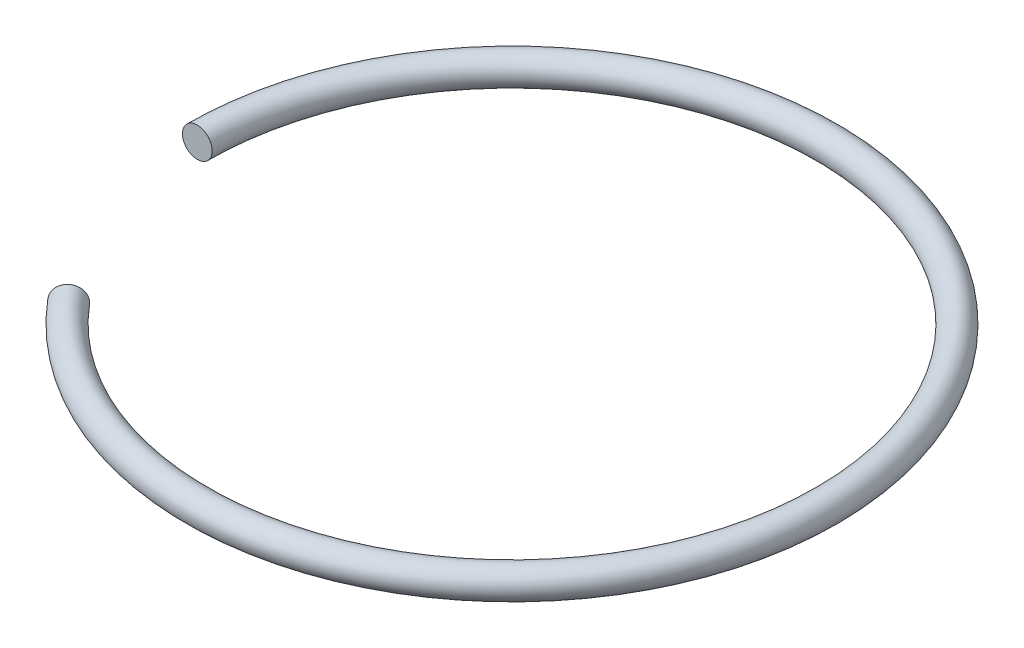
ISO-10303-21;
HEADER;
FILE_DESCRIPTION(('STEP AP214'),'2;1');
FILE_NAME('part.step','',(''),(''),'','','');
FILE_SCHEMA(('AUTOMOTIVE_DESIGN { 1 0 10303 214 1 1 1 1 }'));
ENDSEC;
DATA;
#1=APPLICATION_CONTEXT('core data for automotive mechanical design processes');
#2=APPLICATION_PROTOCOL_DEFINITION('international standard','automotive_design',2000,#1);
#3=PRODUCT_CONTEXT('',#1,'mechanical');
#4=PRODUCT('Part','Part','',(#3));
#5=PRODUCT_RELATED_PRODUCT_CATEGORY('part','',(#4));
#6=PRODUCT_DEFINITION_FORMATION('','',#4);
#7=PRODUCT_DEFINITION_CONTEXT('part definition',#1,'design');
#8=PRODUCT_DEFINITION('design','',#6,#7);
#9=PRODUCT_DEFINITION_SHAPE('','',#8);
#10=(LENGTH_UNIT() NAMED_UNIT(*) SI_UNIT(.MILLI.,.METRE.));
#11=(NAMED_UNIT(*) PLANE_ANGLE_UNIT() SI_UNIT($,.RADIAN.));
#12=(NAMED_UNIT(*) SI_UNIT($,.STERADIAN.) SOLID_ANGLE_UNIT());
#13=UNCERTAINTY_MEASURE_WITH_UNIT(LENGTH_MEASURE(1.E-05),#10,'distance_accuracy_value','');
#14=(GEOMETRIC_REPRESENTATION_CONTEXT(3) GLOBAL_UNCERTAINTY_ASSIGNED_CONTEXT((#13)) GLOBAL_UNIT_ASSIGNED_CONTEXT((#10,
#11,#12)) REPRESENTATION_CONTEXT('',''));
#15=CARTESIAN_POINT('',(0.,0.,0.));
#16=DIRECTION('',(0.,0.,1.));
#17=DIRECTION('',(1.,0.,0.));
#18=AXIS2_PLACEMENT_3D('',#15,#16,#17);
#19=CARTESIAN_POINT('',(0.,0.,0.));
#20=DIRECTION('',(0.64278760968653,0.,0.766044443118986));
#21=DIRECTION('',(0.766044443118986,0.,-0.64278760968653));
#22=AXIS2_PLACEMENT_3D('',#19,#20,#21);
#23=PLANE('',#22);
#24=CARTESIAN_POINT('',(-1.96034603216364,2.413,1.64492563256832));
#25=CARTESIAN_POINT('',(-1.96035292650767,2.42723035707391,1.64493141760985));
#26=CARTESIAN_POINT('',(-1.96221096147189,2.44154828029162,1.64649049406304));
#27=CARTESIAN_POINT('',(-1.9694495467463,2.46852713981076,1.65256438829705));
#28=CARTESIAN_POINT('',(-1.97483009705651,2.48118807611218,1.65707920607787));
#29=CARTESIAN_POINT('',(-1.98849913398992,2.5034838982527,1.66854888992724));
#30=CARTESIAN_POINT('',(-1.99678762061319,2.51311878409172,1.67550375599585));
#31=CARTESIAN_POINT('',(-2.01534020393233,2.52826068307499,1.69107122181633));
#32=CARTESIAN_POINT('',(-2.0256043006282,2.53376769621925,1.69968382156819));
#33=CARTESIAN_POINT('',(-2.04695031684461,2.54003686264336,1.71759525590249));
#34=CARTESIAN_POINT('',(-2.05803223636515,2.54079901592321,1.72689409048491));
#35=CARTESIAN_POINT('',(-2.0797647109435,2.53749255040931,1.74512980188817));
#36=CARTESIAN_POINT('',(-2.0904152660013,2.53342393161555,1.754066678709));
#37=CARTESIAN_POINT('',(-2.11008397027539,2.52091068190603,1.77057068121113));
#38=CARTESIAN_POINT('',(-2.11910211949168,2.51246605099026,1.77813780689242));
#39=CARTESIAN_POINT('',(-2.13449015744858,2.49216861413728,1.7910499038666));
#40=CARTESIAN_POINT('',(-2.14086004618918,2.48031580820007,1.79639487515947));
#41=CARTESIAN_POINT('',(-2.15023018552641,2.4544792051199,1.80425735562142));
#42=CARTESIAN_POINT('',(-2.15323043612304,2.44049540797694,1.80677486479049));
#43=CARTESIAN_POINT('',(-2.15474385138177,2.42191030553464,1.80804477097591));
#44=CARTESIAN_POINT('',(-2.15492348123786,2.41745945246293,1.80819549832191));
#45=CARTESIAN_POINT('',(-2.15491442637183,2.39876964292609,1.80818790038716));
#46=CARTESIAN_POINT('',(-2.15305639140762,2.38445171970838,1.80662882393397));
#47=CARTESIAN_POINT('',(-2.1458178061332,2.35747286018924,1.80055492969997));
#48=CARTESIAN_POINT('',(-2.14043725582299,2.34481192388782,1.79604011191914));
#49=CARTESIAN_POINT('',(-2.12676821888958,2.3225161017473,1.78457042806977));
#50=CARTESIAN_POINT('',(-2.11847973226631,2.31288121590828,1.77761556200116));
#51=CARTESIAN_POINT('',(-2.09992714894717,2.29773931692501,1.76204809618068));
#52=CARTESIAN_POINT('',(-2.0896630522513,2.29223230378075,1.75343549642882));
#53=CARTESIAN_POINT('',(-2.0683170360349,2.28596313735664,1.73552406209453));
#54=CARTESIAN_POINT('',(-2.05723511651435,2.28520098407679,1.7262252275121));
#55=CARTESIAN_POINT('',(-2.03550264193601,2.28850744959069,1.70798951610884));
#56=CARTESIAN_POINT('',(-2.0248520868782,2.29257606838445,1.69905263928801));
#57=CARTESIAN_POINT('',(-2.00518338260411,2.30508931809397,1.68254863678588));
#58=CARTESIAN_POINT('',(-1.99616523338782,2.31353394900974,1.67498151110459));
#59=CARTESIAN_POINT('',(-1.98077719543092,2.33383138586272,1.66206941413042));
#60=CARTESIAN_POINT('',(-1.97440730669032,2.34568419179993,1.65672444283754));
#61=CARTESIAN_POINT('',(-1.96503716735309,2.3715207948801,1.64886196237559));
#62=CARTESIAN_POINT('',(-1.96203691675647,2.38550459202306,1.64634445320652));
#63=CARTESIAN_POINT('',(-1.96052350149774,2.40408969446536,1.6450745470211));
#64=CARTESIAN_POINT('',(-1.96034387164164,2.40854054753707,1.6449238196751));
#65=CARTESIAN_POINT('',(-1.96034603216364,2.413,1.64492563256832));
#66=B_SPLINE_CURVE_WITH_KNOTS('',3,(#24,#25,#26,#27,#28,#29,#30,#31,#32,#33,#34,#35,#36,#37,#38,
#39,#40,#41,#42,#43,#44,#45,#46,#47,#48,#49,#50,#51,#52,#53,#54,#55,#56,#57,#58,#59,#60,#61,#62,
#63,#64,#65),.UNSPECIFIED.,.T.,.F.,(4,2,2,2,2,2,2,2,2,2,2,2,2,2,2,2,2,2,2,2,4),(0.,
0.0426429642402328,0.0852859284804661,0.127928892721775,0.170571856963084,0.213214821204393,
0.255857785445702,0.298500749687011,0.34114371392832,0.383786678169629,0.39714995998469,
0.439792924224922,0.482435888465154,0.525078852706463,0.567721816947773,0.610364781189081,
0.653007745430391,0.6956507096717,0.738293673913009,0.780936638154318,0.794299919969378),.UNSPECIFIED.);
#67=CARTESIAN_POINT('',(-1.96034603216364,2.413,1.64492563256832));
#68=VERTEX_POINT('',#67);
#69=EDGE_CURVE('E18',#68,#68,#66,.T.);
#70=ORIENTED_EDGE('',*,*,#69,.F.);
#71=EDGE_LOOP('',(#70));
#72=FACE_BOUND('',#71,.T.);
#73=ADVANCED_FACE('F14',(#72),#23,.F.);
#74=CARTESIAN_POINT('',(0.,0.,0.));
#75=DIRECTION('',(0.,0.,1.));
#76=DIRECTION('',(1.,0.,0.));
#77=AXIS2_PLACEMENT_3D('',#74,#75,#76);
#78=PLANE('',#77);
#79=CARTESIAN_POINT('',(-2.81305,2.413,0.));
#80=CARTESIAN_POINT('',(-2.81304100007304,2.42723035707391,0.));
#81=CARTESIAN_POINT('',(-2.81061550768693,2.44154828029162,0.));
#82=CARTESIAN_POINT('',(-2.80116620570525,2.46852713981076,0.));
#83=CARTESIAN_POINT('',(-2.79414239610969,2.48118807611218,0.));
#84=CARTESIAN_POINT('',(-2.77629873565866,2.5034838982527,0.));
#85=CARTESIAN_POINT('',(-2.7654788848031,2.51311878409172,0.));
#86=CARTESIAN_POINT('',(-2.74126020730236,2.52826068307499,0.));
#87=CARTESIAN_POINT('',(-2.72786138065716,2.53376769621925,0.));
#88=CARTESIAN_POINT('',(-2.69999613549006,2.54003686264336,0.));
#89=CARTESIAN_POINT('',(-2.68552971696815,2.54079901592321,0.));
#90=CARTESIAN_POINT('',(-2.65715998623835,2.53749255040931,0.));
#91=CARTESIAN_POINT('',(-2.64325667403046,2.53342393161555,0.));
#92=CARTESIAN_POINT('',(-2.61758100409934,2.52091068190603,0.));
#93=CARTESIAN_POINT('',(-2.6058086463761,2.51246605099026,0.));
#94=CARTESIAN_POINT('',(-2.58572098945865,2.49216861413728,0.));
#95=CARTESIAN_POINT('',(-2.57740569026443,2.48031580820007,0.));
#96=CARTESIAN_POINT('',(-2.56517384207155,2.4544792051199,0.));
#97=CARTESIAN_POINT('',(-2.56125729307289,2.44049540797694,0.));
#98=CARTESIAN_POINT('',(-2.55928166976236,2.42191030553464,0.));
#99=CARTESIAN_POINT('',(-2.55904717963883,2.41745945246293,0.));
#100=CARTESIAN_POINT('',(-2.55905899992696,2.39876964292609,0.));
#101=CARTESIAN_POINT('',(-2.56148449231307,2.38445171970838,0.));
#102=CARTESIAN_POINT('',(-2.57093379429475,2.35747286018924,0.));
#103=CARTESIAN_POINT('',(-2.57795760389031,2.34481192388782,0.));
#104=CARTESIAN_POINT('',(-2.59580126434134,2.3225161017473,0.));
#105=CARTESIAN_POINT('',(-2.60662111519689,2.31288121590828,0.));
#106=CARTESIAN_POINT('',(-2.63083979269764,2.29773931692501,0.));
#107=CARTESIAN_POINT('',(-2.64423861934284,2.29223230378075,0.));
#108=CARTESIAN_POINT('',(-2.67210386450994,2.28596313735664,0.));
#109=CARTESIAN_POINT('',(-2.68657028303185,2.28520098407679,0.));
#110=CARTESIAN_POINT('',(-2.71494001376165,2.28850744959069,0.));
#111=CARTESIAN_POINT('',(-2.72884332596954,2.29257606838445,0.));
#112=CARTESIAN_POINT('',(-2.75451899590066,2.30508931809397,0.));
#113=CARTESIAN_POINT('',(-2.7662913536239,2.31353394900974,0.));
#114=CARTESIAN_POINT('',(-2.78637901054135,2.33383138586272,0.));
#115=CARTESIAN_POINT('',(-2.79469430973557,2.34568419179993,0.));
#116=CARTESIAN_POINT('',(-2.80692615792844,2.3715207948801,0.));
#117=CARTESIAN_POINT('',(-2.8108427069271,2.38550459202306,0.));
#118=CARTESIAN_POINT('',(-2.81281833023764,2.40408969446536,0.));
#119=CARTESIAN_POINT('',(-2.81305282036116,2.40854054753707,0.));
#120=CARTESIAN_POINT('',(-2.81305,2.413,0.));
#121=B_SPLINE_CURVE_WITH_KNOTS('',3,(#79,#80,#81,#82,#83,#84,#85,#86,#87,#88,#89,#90,#91,#92,
#93,#94,#95,#96,#97,#98,#99,#100,#101,#102,#103,#104,#105,#106,#107,#108,#109,#110,#111,#112,
#113,#114,#115,#116,#117,#118,#119,#120),.UNSPECIFIED.,.T.,.F.,(4,2,2,2,2,2,2,2,2,2,2,2,2,2,2,2,
2,2,2,2,4),(0.,0.0426429642402328,0.0852859284804657,0.127928892721775,0.170571856963084,
0.213214821204392,0.255857785445702,0.29850074968701,0.34114371392832,0.383786678169629,
0.39714995998469,0.439792924224922,0.482435888465155,0.525078852706464,0.567721816947774,
0.610364781189082,0.653007745430391,0.6956507096717,0.738293673913009,0.780936638154318,
0.794299919969378),.UNSPECIFIED.);
#122=CARTESIAN_POINT('',(-2.81305,2.413,0.));
#123=VERTEX_POINT('',#122);
#124=EDGE_CURVE('E10',#123,#123,#121,.T.);
#125=ORIENTED_EDGE('',*,*,#124,.F.);
#126=EDGE_LOOP('',(#125));
#127=FACE_BOUND('',#126,.T.);
#128=ADVANCED_FACE('F36',(#127),#78,.T.);
#129=CARTESIAN_POINT('',(0.,2.413,0.));
#130=DIRECTION('',(0.,1.,0.));
#131=DIRECTION('',(0.,0.,1.));
#132=AXIS2_PLACEMENT_3D('',#129,#130,#131);
#133=TOROIDAL_SURFACE('',#132,2.68605,0.127000000000001);
#134=ORIENTED_EDGE('',*,*,#124,.T.);
#135=EDGE_LOOP('',(#134));
#136=FACE_BOUND('',#135,.T.);
#137=ORIENTED_EDGE('',*,*,#69,.T.);
#138=EDGE_LOOP('',(#137));
#139=FACE_BOUND('',#138,.T.);
#140=ADVANCED_FACE('F34',(#136,#139),#133,.T.);
#141=CLOSED_SHELL('',(#73,#128,#140));
#142=MANIFOLD_SOLID_BREP('B1',#141);
#143=ADVANCED_BREP_SHAPE_REPRESENTATION('',(#18,#142),#14);
#144=SHAPE_DEFINITION_REPRESENTATION(#9,#143);
ENDSEC;
END-ISO-10303-21;
